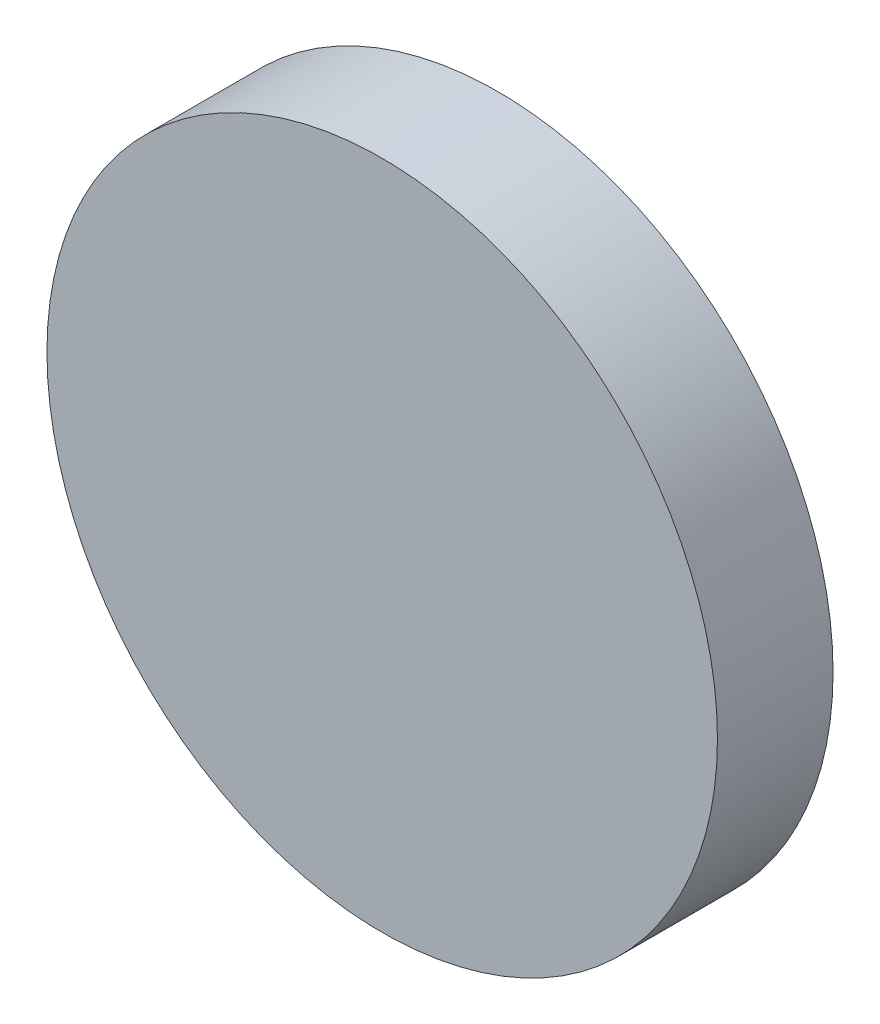
ISO-10303-21;
HEADER;
FILE_DESCRIPTION(('STEP AP214'),'2;1');
FILE_NAME('part.step','',(''),(''),'','','');
FILE_SCHEMA(('AUTOMOTIVE_DESIGN { 1 0 10303 214 1 1 1 1 }'));
ENDSEC;
DATA;
#1=APPLICATION_CONTEXT('core data for automotive mechanical design processes');
#2=APPLICATION_PROTOCOL_DEFINITION('international standard','automotive_design',2000,#1);
#3=PRODUCT_CONTEXT('',#1,'mechanical');
#4=PRODUCT('Part','Part','',(#3));
#5=PRODUCT_RELATED_PRODUCT_CATEGORY('part','',(#4));
#6=PRODUCT_DEFINITION_FORMATION('','',#4);
#7=PRODUCT_DEFINITION_CONTEXT('part definition',#1,'design');
#8=PRODUCT_DEFINITION('design','',#6,#7);
#9=PRODUCT_DEFINITION_SHAPE('','',#8);
#10=(LENGTH_UNIT() NAMED_UNIT(*) SI_UNIT(.MILLI.,.METRE.));
#11=(NAMED_UNIT(*) PLANE_ANGLE_UNIT() SI_UNIT($,.RADIAN.));
#12=(NAMED_UNIT(*) SI_UNIT($,.STERADIAN.) SOLID_ANGLE_UNIT());
#13=UNCERTAINTY_MEASURE_WITH_UNIT(LENGTH_MEASURE(1.E-05),#10,'distance_accuracy_value','');
#14=(GEOMETRIC_REPRESENTATION_CONTEXT(3) GLOBAL_UNCERTAINTY_ASSIGNED_CONTEXT((#13)) GLOBAL_UNIT_ASSIGNED_CONTEXT((#10,
#11,#12)) REPRESENTATION_CONTEXT('',''));
#15=CARTESIAN_POINT('',(0.,0.,0.));
#16=DIRECTION('',(0.,0.,1.));
#17=DIRECTION('',(1.,0.,0.));
#18=AXIS2_PLACEMENT_3D('',#15,#16,#17);
#19=CARTESIAN_POINT('',(0.,0.,0.));
#20=DIRECTION('',(0.,0.,1.));
#21=DIRECTION('',(1.,0.,0.));
#22=AXIS2_PLACEMENT_3D('',#19,#20,#21);
#23=PLANE('',#22);
#24=CARTESIAN_POINT('',(0.,0.,0.));
#25=DIRECTION('',(0.,0.,1.));
#26=DIRECTION('',(1.,0.,0.));
#27=AXIS2_PLACEMENT_3D('',#24,#25,#26);
#28=CIRCLE('',#27,1.45);
#29=CARTESIAN_POINT('',(1.45,0.,0.));
#30=VERTEX_POINT('',#29);
#31=EDGE_CURVE('E18',#30,#30,#28,.T.);
#32=ORIENTED_EDGE('',*,*,#31,.F.);
#33=EDGE_LOOP('',(#32));
#34=FACE_BOUND('',#33,.T.);
#35=ADVANCED_FACE('F15',(#34),#23,.F.);
#36=CARTESIAN_POINT('',(0.,0.,0.));
#37=DIRECTION('',(0.,0.,1.));
#38=DIRECTION('',(1.,0.,0.));
#39=AXIS2_PLACEMENT_3D('',#36,#37,#38);
#40=CYLINDRICAL_SURFACE('',#39,1.45);
#41=CARTESIAN_POINT('',(0.,0.,0.5));
#42=DIRECTION('',(0.,0.,1.));
#43=DIRECTION('',(1.,0.,0.));
#44=AXIS2_PLACEMENT_3D('',#41,#42,#43);
#45=CIRCLE('',#44,1.45);
#46=CARTESIAN_POINT('',(1.45,0.,0.5));
#47=VERTEX_POINT('',#46);
#48=EDGE_CURVE('E10',#47,#47,#45,.T.);
#49=ORIENTED_EDGE('',*,*,#48,.F.);
#50=EDGE_LOOP('',(#49));
#51=FACE_BOUND('',#50,.T.);
#52=ORIENTED_EDGE('',*,*,#31,.T.);
#53=EDGE_LOOP('',(#52));
#54=FACE_BOUND('',#53,.T.);
#55=ADVANCED_FACE('F27',(#51,#54),#40,.T.);
#56=CARTESIAN_POINT('',(0.,0.,0.5));
#57=DIRECTION('',(0.,0.,1.));
#58=DIRECTION('',(1.,0.,0.));
#59=AXIS2_PLACEMENT_3D('',#56,#57,#58);
#60=PLANE('',#59);
#61=ORIENTED_EDGE('',*,*,#48,.T.);
#62=EDGE_LOOP('',(#61));
#63=FACE_BOUND('',#62,.T.);
#64=ADVANCED_FACE('F34',(#63),#60,.T.);
#65=CLOSED_SHELL('',(#35,#55,#64));
#66=MANIFOLD_SOLID_BREP('B1',#65);
#67=ADVANCED_BREP_SHAPE_REPRESENTATION('',(#18,#66),#14);
#68=SHAPE_DEFINITION_REPRESENTATION(#9,#67);
ENDSEC;
END-ISO-10303-21;
